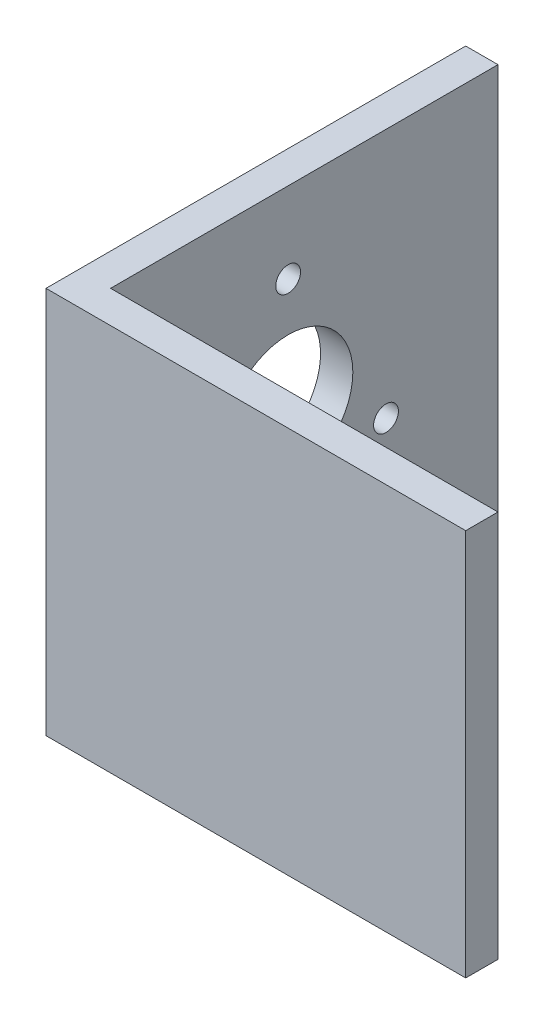
ISO-10303-21;
HEADER;
FILE_DESCRIPTION(('STEP AP214'),'2;1');
FILE_NAME('part.step','',(''),(''),'','','');
FILE_SCHEMA(('AUTOMOTIVE_DESIGN { 1 0 10303 214 1 1 1 1 }'));
ENDSEC;
DATA;
#1=APPLICATION_CONTEXT('core data for automotive mechanical design processes');
#2=APPLICATION_PROTOCOL_DEFINITION('international standard','automotive_design',2000,#1);
#3=PRODUCT_CONTEXT('',#1,'mechanical');
#4=PRODUCT('Part','Part','',(#3));
#5=PRODUCT_RELATED_PRODUCT_CATEGORY('part','',(#4));
#6=PRODUCT_DEFINITION_FORMATION('','',#4);
#7=PRODUCT_DEFINITION_CONTEXT('part definition',#1,'design');
#8=PRODUCT_DEFINITION('design','',#6,#7);
#9=PRODUCT_DEFINITION_SHAPE('','',#8);
#10=(LENGTH_UNIT() NAMED_UNIT(*) SI_UNIT(.MILLI.,.METRE.));
#11=(NAMED_UNIT(*) PLANE_ANGLE_UNIT() SI_UNIT($,.RADIAN.));
#12=(NAMED_UNIT(*) SI_UNIT($,.STERADIAN.) SOLID_ANGLE_UNIT());
#13=UNCERTAINTY_MEASURE_WITH_UNIT(LENGTH_MEASURE(1.E-05),#10,'distance_accuracy_value','');
#14=(GEOMETRIC_REPRESENTATION_CONTEXT(3) GLOBAL_UNCERTAINTY_ASSIGNED_CONTEXT((#13)) GLOBAL_UNIT_ASSIGNED_CONTEXT((#10,
#11,#12)) REPRESENTATION_CONTEXT('',''));
#15=CARTESIAN_POINT('',(0.,0.,0.));
#16=DIRECTION('',(0.,0.,1.));
#17=DIRECTION('',(1.,0.,0.));
#18=AXIS2_PLACEMENT_3D('',#15,#16,#17);
#19=CARTESIAN_POINT('',(0.,38.1,3.175));
#20=DIRECTION('',(0.,0.,-1.));
#21=DIRECTION('',(-1.,0.,0.));
#22=AXIS2_PLACEMENT_3D('',#19,#20,#21);
#23=PLANE('',#22);
#24=DIRECTION('',(1.,0.,0.));
#25=VECTOR('',#24,1.);
#26=CARTESIAN_POINT('',(0.,0.,3.175));
#27=LINE('',#26,#25);
#28=CARTESIAN_POINT('',(-3.175,0.,3.175));
#29=VERTEX_POINT('',#28);
#30=CARTESIAN_POINT('',(38.1,0.,3.175));
#31=VERTEX_POINT('',#30);
#32=EDGE_CURVE('E118',#29,#31,#27,.T.);
#33=ORIENTED_EDGE('',*,*,#32,.T.);
#34=DIRECTION('',(0.,-1.,0.));
#35=VECTOR('',#34,1.);
#36=CARTESIAN_POINT('',(38.1,38.1,3.175));
#37=LINE('',#36,#35);
#38=CARTESIAN_POINT('',(38.1,38.1,3.175));
#39=VERTEX_POINT('',#38);
#40=EDGE_CURVE('E11',#39,#31,#37,.T.);
#41=ORIENTED_EDGE('',*,*,#40,.F.);
#42=DIRECTION('',(1.,0.,0.));
#43=VECTOR('',#42,1.);
#44=CARTESIAN_POINT('',(0.,38.1,3.175));
#45=LINE('',#44,#43);
#46=CARTESIAN_POINT('',(-3.175,38.1,3.175));
#47=VERTEX_POINT('',#46);
#48=EDGE_CURVE('E83',#47,#39,#45,.T.);
#49=ORIENTED_EDGE('',*,*,#48,.F.);
#50=DIRECTION('',(0.,-1.,0.));
#51=VECTOR('',#50,1.);
#52=CARTESIAN_POINT('',(-3.175,38.1,3.175));
#53=LINE('',#52,#51);
#54=EDGE_CURVE('E114',#47,#29,#53,.T.);
#55=ORIENTED_EDGE('',*,*,#54,.T.);
#56=EDGE_LOOP('',(#33,#41,#49,#55));
#57=FACE_BOUND('',#56,.T.);
#58=ADVANCED_FACE('F37',(#57),#23,.F.);
#59=CARTESIAN_POINT('',(38.1,38.1,0.));
#60=DIRECTION('',(1.,0.,0.));
#61=DIRECTION('',(0.,0.,-1.));
#62=AXIS2_PLACEMENT_3D('',#59,#60,#61);
#63=PLANE('',#62);
#64=DIRECTION('',(0.,0.,1.));
#65=VECTOR('',#64,1.);
#66=CARTESIAN_POINT('',(38.1,0.,0.));
#67=LINE('',#66,#65);
#68=CARTESIAN_POINT('',(38.1,0.,0.));
#69=VERTEX_POINT('',#68);
#70=EDGE_CURVE('E121',#69,#31,#67,.T.);
#71=ORIENTED_EDGE('',*,*,#70,.F.);
#72=DIRECTION('',(0.,-1.,0.));
#73=VECTOR('',#72,1.);
#74=CARTESIAN_POINT('',(38.1,38.1,0.));
#75=LINE('',#74,#73);
#76=CARTESIAN_POINT('',(38.1,38.1,0.));
#77=VERTEX_POINT('',#76);
#78=EDGE_CURVE('E45',#77,#69,#75,.T.);
#79=ORIENTED_EDGE('',*,*,#78,.F.);
#80=DIRECTION('',(0.,0.,1.));
#81=VECTOR('',#80,1.);
#82=CARTESIAN_POINT('',(38.1,38.1,0.));
#83=LINE('',#82,#81);
#84=EDGE_CURVE('E195',#77,#39,#83,.T.);
#85=ORIENTED_EDGE('',*,*,#84,.T.);
#86=ORIENTED_EDGE('',*,*,#40,.T.);
#87=EDGE_LOOP('',(#71,#79,#85,#86));
#88=FACE_BOUND('',#87,.T.);
#89=ADVANCED_FACE('F140',(#88),#63,.T.);
#90=CARTESIAN_POINT('',(0.,38.1,0.));
#91=DIRECTION('',(0.,0.,-1.));
#92=DIRECTION('',(-1.,0.,0.));
#93=AXIS2_PLACEMENT_3D('',#90,#91,#92);
#94=PLANE('',#93);
#95=DIRECTION('',(1.,0.,0.));
#96=VECTOR('',#95,1.);
#97=CARTESIAN_POINT('',(0.,0.,0.));
#98=LINE('',#97,#96);
#99=CARTESIAN_POINT('',(0.,0.,0.));
#100=VERTEX_POINT('',#99);
#101=EDGE_CURVE('E125',#100,#69,#98,.T.);
#102=ORIENTED_EDGE('',*,*,#101,.F.);
#103=DIRECTION('',(0.,-1.,0.));
#104=VECTOR('',#103,1.);
#105=CARTESIAN_POINT('',(0.,38.1,0.));
#106=LINE('',#105,#104);
#107=CARTESIAN_POINT('',(0.,38.1,0.));
#108=VERTEX_POINT('',#107);
#109=EDGE_CURVE('E104',#108,#100,#106,.T.);
#110=ORIENTED_EDGE('',*,*,#109,.F.);
#111=DIRECTION('',(1.,0.,0.));
#112=VECTOR('',#111,1.);
#113=CARTESIAN_POINT('',(0.,38.1,0.));
#114=LINE('',#113,#112);
#115=EDGE_CURVE('E110',#108,#77,#114,.T.);
#116=ORIENTED_EDGE('',*,*,#115,.T.);
#117=ORIENTED_EDGE('',*,*,#78,.T.);
#118=EDGE_LOOP('',(#102,#110,#116,#117));
#119=FACE_BOUND('',#118,.T.);
#120=ADVANCED_FACE('F137',(#119),#94,.T.);
#121=CARTESIAN_POINT('',(0.,38.1,-38.1));
#122=DIRECTION('',(1.,0.,0.));
#123=DIRECTION('',(0.,0.,-1.));
#124=AXIS2_PLACEMENT_3D('',#121,#122,#123);
#125=PLANE('',#124);
#126=CARTESIAN_POINT('',(0.,30.1625,-17.4625));
#127=DIRECTION('',(1.,0.,0.));
#128=DIRECTION('',(0.,0.,-1.));
#129=AXIS2_PLACEMENT_3D('',#126,#127,#128);
#130=CIRCLE('',#129,1.21919999999999);
#131=CARTESIAN_POINT('',(0.,30.1625,-18.6817));
#132=VERTEX_POINT('',#131);
#133=EDGE_CURVE('E176',#132,#132,#130,.T.);
#134=ORIENTED_EDGE('',*,*,#133,.F.);
#135=EDGE_LOOP('',(#134));
#136=FACE_BOUND('',#135,.T.);
#137=CARTESIAN_POINT('',(0.,13.49375,-7.83879270044543));
#138=DIRECTION('',(1.,0.,0.));
#139=DIRECTION('',(0.,0.,-1.));
#140=AXIS2_PLACEMENT_3D('',#137,#138,#139);
#141=CIRCLE('',#140,1.2192);
#142=CARTESIAN_POINT('',(0.,13.49375,-9.05799270044542));
#143=VERTEX_POINT('',#142);
#144=EDGE_CURVE('E180',#143,#143,#141,.T.);
#145=ORIENTED_EDGE('',*,*,#144,.F.);
#146=EDGE_LOOP('',(#145));
#147=FACE_BOUND('',#146,.T.);
#148=CARTESIAN_POINT('',(0.,13.49375,-27.0862072995546));
#149=DIRECTION('',(1.,0.,0.));
#150=DIRECTION('',(0.,0.,-1.));
#151=AXIS2_PLACEMENT_3D('',#148,#149,#150);
#152=CIRCLE('',#151,1.2192);
#153=CARTESIAN_POINT('',(0.,13.49375,-28.3054072995546));
#154=VERTEX_POINT('',#153);
#155=EDGE_CURVE('E184',#154,#154,#152,.T.);
#156=ORIENTED_EDGE('',*,*,#155,.F.);
#157=EDGE_LOOP('',(#156));
#158=FACE_BOUND('',#157,.T.);
#159=CARTESIAN_POINT('',(0.,19.05,-17.4625));
#160=DIRECTION('',(1.,0.,0.));
#161=DIRECTION('',(0.,0.,-1.));
#162=AXIS2_PLACEMENT_3D('',#159,#160,#161);
#163=CIRCLE('',#162,6.3627);
#164=CARTESIAN_POINT('',(0.,19.05,-23.8252));
#165=VERTEX_POINT('',#164);
#166=EDGE_CURVE('E122',#165,#165,#163,.T.);
#167=ORIENTED_EDGE('',*,*,#166,.F.);
#168=EDGE_LOOP('',(#167));
#169=FACE_BOUND('',#168,.T.);
#170=DIRECTION('',(0.,0.,1.));
#171=VECTOR('',#170,1.);
#172=CARTESIAN_POINT('',(0.,0.,-38.1));
#173=LINE('',#172,#171);
#174=CARTESIAN_POINT('',(0.,0.,-38.1));
#175=VERTEX_POINT('',#174);
#176=EDGE_CURVE('E99',#175,#100,#173,.T.);
#177=ORIENTED_EDGE('',*,*,#176,.F.);
#178=DIRECTION('',(0.,-1.,0.));
#179=VECTOR('',#178,1.);
#180=CARTESIAN_POINT('',(0.,38.1,-38.1));
#181=LINE('',#180,#179);
#182=CARTESIAN_POINT('',(0.,38.1,-38.1));
#183=VERTEX_POINT('',#182);
#184=EDGE_CURVE('E94',#183,#175,#181,.T.);
#185=ORIENTED_EDGE('',*,*,#184,.F.);
#186=DIRECTION('',(0.,0.,1.));
#187=VECTOR('',#186,1.);
#188=CARTESIAN_POINT('',(0.,38.1,-38.1));
#189=LINE('',#188,#187);
#190=EDGE_CURVE('E97',#183,#108,#189,.T.);
#191=ORIENTED_EDGE('',*,*,#190,.T.);
#192=ORIENTED_EDGE('',*,*,#109,.T.);
#193=EDGE_LOOP('',(#177,#185,#191,#192));
#194=FACE_BOUND('',#193,.T.);
#195=ADVANCED_FACE('F96',(#136,#147,#158,#169,#194),#125,.T.);
#196=CARTESIAN_POINT('',(-3.175,38.1,-38.1));
#197=DIRECTION('',(0.,0.,-1.));
#198=DIRECTION('',(-1.,0.,0.));
#199=AXIS2_PLACEMENT_3D('',#196,#197,#198);
#200=PLANE('',#199);
#201=DIRECTION('',(1.,0.,0.));
#202=VECTOR('',#201,1.);
#203=CARTESIAN_POINT('',(-3.175,0.,-38.1));
#204=LINE('',#203,#202);
#205=CARTESIAN_POINT('',(-3.175,0.,-38.1));
#206=VERTEX_POINT('',#205);
#207=EDGE_CURVE('E129',#206,#175,#204,.T.);
#208=ORIENTED_EDGE('',*,*,#207,.F.);
#209=DIRECTION('',(0.,-1.,0.));
#210=VECTOR('',#209,1.);
#211=CARTESIAN_POINT('',(-3.175,38.1,-38.1));
#212=LINE('',#211,#210);
#213=CARTESIAN_POINT('',(-3.175,38.1,-38.1));
#214=VERTEX_POINT('',#213);
#215=EDGE_CURVE('E74',#214,#206,#212,.T.);
#216=ORIENTED_EDGE('',*,*,#215,.F.);
#217=DIRECTION('',(1.,0.,0.));
#218=VECTOR('',#217,1.);
#219=CARTESIAN_POINT('',(-3.175,38.1,-38.1));
#220=LINE('',#219,#218);
#221=EDGE_CURVE('E108',#214,#183,#220,.T.);
#222=ORIENTED_EDGE('',*,*,#221,.T.);
#223=ORIENTED_EDGE('',*,*,#184,.T.);
#224=EDGE_LOOP('',(#208,#216,#222,#223));
#225=FACE_BOUND('',#224,.T.);
#226=ADVANCED_FACE('F112',(#225),#200,.T.);
#227=CARTESIAN_POINT('',(-3.175,38.1,-38.1));
#228=DIRECTION('',(1.,0.,0.));
#229=DIRECTION('',(0.,0.,-1.));
#230=AXIS2_PLACEMENT_3D('',#227,#228,#229);
#231=PLANE('',#230);
#232=CARTESIAN_POINT('',(-3.175,30.1625,-17.4625));
#233=DIRECTION('',(-1.,0.,0.));
#234=DIRECTION('',(0.,0.,1.));
#235=AXIS2_PLACEMENT_3D('',#232,#233,#234);
#236=CIRCLE('',#235,1.2192);
#237=CARTESIAN_POINT('',(-3.175,30.1625,-16.2433));
#238=VERTEX_POINT('',#237);
#239=EDGE_CURVE('E205',#238,#238,#236,.T.);
#240=ORIENTED_EDGE('',*,*,#239,.F.);
#241=EDGE_LOOP('',(#240));
#242=FACE_BOUND('',#241,.T.);
#243=CARTESIAN_POINT('',(-3.175,13.49375,-7.83879270044543));
#244=DIRECTION('',(-1.,0.,0.));
#245=DIRECTION('',(0.,0.,1.));
#246=AXIS2_PLACEMENT_3D('',#243,#244,#245);
#247=CIRCLE('',#246,1.2192);
#248=CARTESIAN_POINT('',(-3.175,13.49375,-6.61959270044543));
#249=VERTEX_POINT('',#248);
#250=EDGE_CURVE('E201',#249,#249,#247,.T.);
#251=ORIENTED_EDGE('',*,*,#250,.F.);
#252=EDGE_LOOP('',(#251));
#253=FACE_BOUND('',#252,.T.);
#254=CARTESIAN_POINT('',(-3.175,13.49375,-27.0862072995546));
#255=DIRECTION('',(-1.,0.,0.));
#256=DIRECTION('',(0.,0.,1.));
#257=AXIS2_PLACEMENT_3D('',#254,#255,#256);
#258=CIRCLE('',#257,1.2192);
#259=CARTESIAN_POINT('',(-3.175,13.49375,-25.8670072995546));
#260=VERTEX_POINT('',#259);
#261=EDGE_CURVE('E197',#260,#260,#258,.T.);
#262=ORIENTED_EDGE('',*,*,#261,.F.);
#263=EDGE_LOOP('',(#262));
#264=FACE_BOUND('',#263,.T.);
#265=CARTESIAN_POINT('',(-3.175,19.05,-17.4625));
#266=DIRECTION('',(-1.,0.,0.));
#267=DIRECTION('',(0.,0.,1.));
#268=AXIS2_PLACEMENT_3D('',#265,#266,#267);
#269=CIRCLE('',#268,6.3627);
#270=CARTESIAN_POINT('',(-3.175,19.05,-11.0998));
#271=VERTEX_POINT('',#270);
#272=EDGE_CURVE('E188',#271,#271,#269,.T.);
#273=ORIENTED_EDGE('',*,*,#272,.F.);
#274=EDGE_LOOP('',(#273));
#275=FACE_BOUND('',#274,.T.);
#276=DIRECTION('',(0.,0.,-1.));
#277=VECTOR('',#276,1.);
#278=CARTESIAN_POINT('',(-3.175,0.,-38.1));
#279=LINE('',#278,#277);
#280=EDGE_CURVE('E77',#206,#29,#279,.F.);
#281=ORIENTED_EDGE('',*,*,#280,.T.);
#282=ORIENTED_EDGE('',*,*,#54,.F.);
#283=DIRECTION('',(0.,0.,-1.));
#284=VECTOR('',#283,1.);
#285=CARTESIAN_POINT('',(-3.175,38.1,-38.1));
#286=LINE('',#285,#284);
#287=EDGE_CURVE('E53',#214,#47,#286,.F.);
#288=ORIENTED_EDGE('',*,*,#287,.F.);
#289=ORIENTED_EDGE('',*,*,#215,.T.);
#290=EDGE_LOOP('',(#281,#282,#288,#289));
#291=FACE_BOUND('',#290,.T.);
#292=ADVANCED_FACE('F145',(#242,#253,#264,#275,#291),#231,.F.);
#293=CARTESIAN_POINT('',(0.,38.1,0.));
#294=DIRECTION('',(0.,-1.,0.));
#295=DIRECTION('',(-1.,0.,0.));
#296=AXIS2_PLACEMENT_3D('',#293,#294,#295);
#297=PLANE('',#296);
#298=ORIENTED_EDGE('',*,*,#48,.T.);
#299=ORIENTED_EDGE('',*,*,#84,.F.);
#300=ORIENTED_EDGE('',*,*,#115,.F.);
#301=ORIENTED_EDGE('',*,*,#190,.F.);
#302=ORIENTED_EDGE('',*,*,#221,.F.);
#303=ORIENTED_EDGE('',*,*,#287,.T.);
#304=EDGE_LOOP('',(#298,#299,#300,#301,#302,#303));
#305=FACE_BOUND('',#304,.T.);
#306=ADVANCED_FACE('F107',(#305),#297,.F.);
#307=CARTESIAN_POINT('',(0.,0.,0.));
#308=DIRECTION('',(0.,-1.,0.));
#309=DIRECTION('',(-1.,0.,0.));
#310=AXIS2_PLACEMENT_3D('',#307,#308,#309);
#311=PLANE('',#310);
#312=ORIENTED_EDGE('',*,*,#32,.F.);
#313=ORIENTED_EDGE('',*,*,#280,.F.);
#314=ORIENTED_EDGE('',*,*,#207,.T.);
#315=ORIENTED_EDGE('',*,*,#176,.T.);
#316=ORIENTED_EDGE('',*,*,#101,.T.);
#317=ORIENTED_EDGE('',*,*,#70,.T.);
#318=EDGE_LOOP('',(#312,#313,#314,#315,#316,#317));
#319=FACE_BOUND('',#318,.T.);
#320=ADVANCED_FACE('F143',(#319),#311,.T.);
#321=CARTESIAN_POINT('',(38.1,19.05,-17.4625));
#322=DIRECTION('',(-1.,0.,0.));
#323=DIRECTION('',(0.,0.,1.));
#324=AXIS2_PLACEMENT_3D('',#321,#322,#323);
#325=CYLINDRICAL_SURFACE('',#324,6.3627);
#326=ORIENTED_EDGE('',*,*,#166,.T.);
#327=EDGE_LOOP('',(#326));
#328=FACE_BOUND('',#327,.T.);
#329=ORIENTED_EDGE('',*,*,#272,.T.);
#330=EDGE_LOOP('',(#329));
#331=FACE_BOUND('',#330,.T.);
#332=ADVANCED_FACE('F222',(#328,#331),#325,.F.);
#333=CARTESIAN_POINT('',(-3.175,13.49375,-27.0862072995546));
#334=DIRECTION('',(-1.,0.,0.));
#335=DIRECTION('',(0.,0.,1.));
#336=AXIS2_PLACEMENT_3D('',#333,#334,#335);
#337=CYLINDRICAL_SURFACE('',#336,1.2192);
#338=ORIENTED_EDGE('',*,*,#155,.T.);
#339=EDGE_LOOP('',(#338));
#340=FACE_BOUND('',#339,.T.);
#341=ORIENTED_EDGE('',*,*,#261,.T.);
#342=EDGE_LOOP('',(#341));
#343=FACE_BOUND('',#342,.T.);
#344=ADVANCED_FACE('F216',(#340,#343),#337,.F.);
#345=CARTESIAN_POINT('',(-3.175,13.49375,-7.83879270044543));
#346=DIRECTION('',(-1.,0.,0.));
#347=DIRECTION('',(0.,0.,1.));
#348=AXIS2_PLACEMENT_3D('',#345,#346,#347);
#349=CYLINDRICAL_SURFACE('',#348,1.2192);
#350=ORIENTED_EDGE('',*,*,#144,.T.);
#351=EDGE_LOOP('',(#350));
#352=FACE_BOUND('',#351,.T.);
#353=ORIENTED_EDGE('',*,*,#250,.T.);
#354=EDGE_LOOP('',(#353));
#355=FACE_BOUND('',#354,.T.);
#356=ADVANCED_FACE('F210',(#352,#355),#349,.F.);
#357=CARTESIAN_POINT('',(-3.175,30.1625,-17.4625));
#358=DIRECTION('',(-1.,0.,0.));
#359=DIRECTION('',(0.,0.,1.));
#360=AXIS2_PLACEMENT_3D('',#357,#358,#359);
#361=CYLINDRICAL_SURFACE('',#360,1.21919999999999);
#362=ORIENTED_EDGE('',*,*,#133,.T.);
#363=EDGE_LOOP('',(#362));
#364=FACE_BOUND('',#363,.T.);
#365=ORIENTED_EDGE('',*,*,#239,.T.);
#366=EDGE_LOOP('',(#365));
#367=FACE_BOUND('',#366,.T.);
#368=ADVANCED_FACE('F208',(#364,#367),#361,.F.);
#369=CLOSED_SHELL('',(#58,#89,#120,#195,#226,#292,#306,#320,#332,#344,#356,#368));
#370=MANIFOLD_SOLID_BREP('B2',#369);
#371=ADVANCED_BREP_SHAPE_REPRESENTATION('',(#18,#370),#14);
#372=SHAPE_DEFINITION_REPRESENTATION(#9,#371);
ENDSEC;
END-ISO-10303-21;
